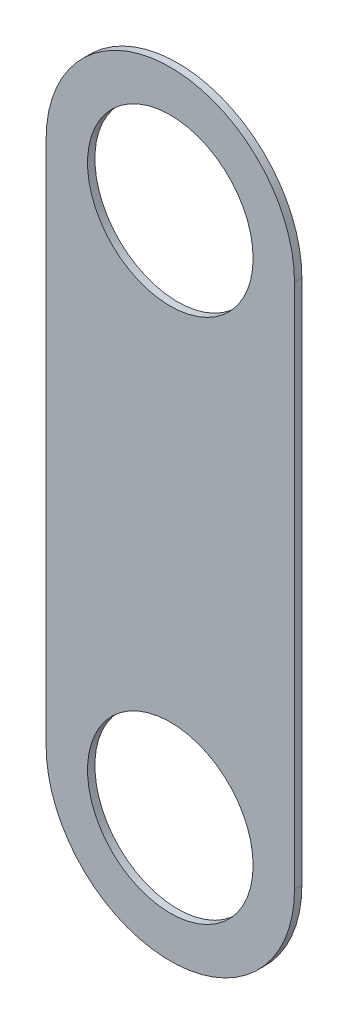
ISO-10303-21;
HEADER;
FILE_DESCRIPTION(('STEP AP214'),'2;1');
FILE_NAME('part.step','',(''),(''),'','','');
FILE_SCHEMA(('AUTOMOTIVE_DESIGN { 1 0 10303 214 1 1 1 1 }'));
ENDSEC;
DATA;
#1=APPLICATION_CONTEXT('core data for automotive mechanical design processes');
#2=APPLICATION_PROTOCOL_DEFINITION('international standard','automotive_design',2000,#1);
#3=PRODUCT_CONTEXT('',#1,'mechanical');
#4=PRODUCT('Part','Part','',(#3));
#5=PRODUCT_RELATED_PRODUCT_CATEGORY('part','',(#4));
#6=PRODUCT_DEFINITION_FORMATION('','',#4);
#7=PRODUCT_DEFINITION_CONTEXT('part definition',#1,'design');
#8=PRODUCT_DEFINITION('design','',#6,#7);
#9=PRODUCT_DEFINITION_SHAPE('','',#8);
#10=(LENGTH_UNIT() NAMED_UNIT(*) SI_UNIT(.MILLI.,.METRE.));
#11=(NAMED_UNIT(*) PLANE_ANGLE_UNIT() SI_UNIT($,.RADIAN.));
#12=(NAMED_UNIT(*) SI_UNIT($,.STERADIAN.) SOLID_ANGLE_UNIT());
#13=UNCERTAINTY_MEASURE_WITH_UNIT(LENGTH_MEASURE(1.E-05),#10,'distance_accuracy_value','');
#14=(GEOMETRIC_REPRESENTATION_CONTEXT(3) GLOBAL_UNCERTAINTY_ASSIGNED_CONTEXT((#13)) GLOBAL_UNIT_ASSIGNED_CONTEXT((#10,
#11,#12)) REPRESENTATION_CONTEXT('',''));
#15=CARTESIAN_POINT('',(0.,0.,0.));
#16=DIRECTION('',(0.,0.,1.));
#17=DIRECTION('',(1.,0.,0.));
#18=AXIS2_PLACEMENT_3D('',#15,#16,#17);
#19=CARTESIAN_POINT('',(67.3800024,82.9600068,0.));
#20=DIRECTION('',(-1.,0.,0.));
#21=DIRECTION('',(0.,1.,0.));
#22=AXIS2_PLACEMENT_3D('',#19,#20,#21);
#23=PLANE('',#22);
#24=DIRECTION('',(0.,1.,0.));
#25=VECTOR('',#24,1.);
#26=CARTESIAN_POINT('',(67.3800024,82.9600068,0.03556));
#27=LINE('',#26,#25);
#28=CARTESIAN_POINT('',(67.3800024,82.9600068,0.03556));
#29=VERTEX_POINT('',#28);
#30=CARTESIAN_POINT('',(67.3800024,85.5000068,0.03556));
#31=VERTEX_POINT('',#30);
#32=EDGE_CURVE('E11',#29,#31,#27,.T.);
#33=ORIENTED_EDGE('',*,*,#32,.F.);
#34=DIRECTION('',(0.,0.,1.));
#35=VECTOR('',#34,1.);
#36=CARTESIAN_POINT('',(67.3800024,82.9600068,0.));
#37=LINE('',#36,#35);
#38=CARTESIAN_POINT('',(67.3800024,82.9600068,0.));
#39=VERTEX_POINT('',#38);
#40=EDGE_CURVE('E24',#39,#29,#37,.T.);
#41=ORIENTED_EDGE('',*,*,#40,.F.);
#42=DIRECTION('',(0.,1.,0.));
#43=VECTOR('',#42,1.);
#44=CARTESIAN_POINT('',(67.3800024,82.9600068,0.));
#45=LINE('',#44,#43);
#46=CARTESIAN_POINT('',(67.3800024,85.5000068,0.));
#47=VERTEX_POINT('',#46);
#48=EDGE_CURVE('E110',#39,#47,#45,.T.);
#49=ORIENTED_EDGE('',*,*,#48,.T.);
#50=DIRECTION('',(0.,0.,1.));
#51=VECTOR('',#50,1.);
#52=CARTESIAN_POINT('',(67.3800024,85.5000068,0.));
#53=LINE('',#52,#51);
#54=EDGE_CURVE('E37',#47,#31,#53,.T.);
#55=ORIENTED_EDGE('',*,*,#54,.T.);
#56=EDGE_LOOP('',(#33,#41,#49,#55));
#57=FACE_BOUND('',#56,.T.);
#58=ADVANCED_FACE('F17',(#57),#23,.F.);
#59=CARTESIAN_POINT('',(66.7800036,82.9600068,0.));
#60=DIRECTION('',(0.,0.,-1.));
#61=DIRECTION('',(-1.,0.,0.));
#62=AXIS2_PLACEMENT_3D('',#59,#60,#61);
#63=CYLINDRICAL_SURFACE('',#62,0.599998800000004);
#64=CARTESIAN_POINT('',(66.7800036,82.9600068,0.03556));
#65=DIRECTION('',(0.,0.,1.));
#66=DIRECTION('',(-1.,0.,0.));
#67=AXIS2_PLACEMENT_3D('',#64,#65,#66);
#68=CIRCLE('',#67,0.599998800000004);
#69=CARTESIAN_POINT('',(66.1800048,82.9600068,0.03556));
#70=VERTEX_POINT('',#69);
#71=EDGE_CURVE('E106',#70,#29,#68,.T.);
#72=ORIENTED_EDGE('',*,*,#71,.F.);
#73=DIRECTION('',(0.,0.,1.));
#74=VECTOR('',#73,1.);
#75=CARTESIAN_POINT('',(66.1800048,82.9600068,0.));
#76=LINE('',#75,#74);
#77=CARTESIAN_POINT('',(66.1800048,82.9600068,0.));
#78=VERTEX_POINT('',#77);
#79=EDGE_CURVE('E104',#78,#70,#76,.T.);
#80=ORIENTED_EDGE('',*,*,#79,.F.);
#81=CARTESIAN_POINT('',(66.7800036,82.9600068,0.));
#82=DIRECTION('',(0.,0.,1.));
#83=DIRECTION('',(-1.,0.,0.));
#84=AXIS2_PLACEMENT_3D('',#81,#82,#83);
#85=CIRCLE('',#84,0.599998800000004);
#86=EDGE_CURVE('E102',#78,#39,#85,.T.);
#87=ORIENTED_EDGE('',*,*,#86,.T.);
#88=ORIENTED_EDGE('',*,*,#40,.T.);
#89=EDGE_LOOP('',(#72,#80,#87,#88));
#90=FACE_BOUND('',#89,.T.);
#91=ADVANCED_FACE('F126',(#90),#63,.T.);
#92=CARTESIAN_POINT('',(66.7800036,85.5000068,0.));
#93=DIRECTION('',(0.,0.,-1.));
#94=DIRECTION('',(1.,0.,0.));
#95=AXIS2_PLACEMENT_3D('',#92,#93,#94);
#96=CYLINDRICAL_SURFACE('',#95,0.599998800000004);
#97=CARTESIAN_POINT('',(66.7800036,85.5000068,0.03556));
#98=DIRECTION('',(0.,0.,1.));
#99=DIRECTION('',(1.,0.,0.));
#100=AXIS2_PLACEMENT_3D('',#97,#98,#99);
#101=CIRCLE('',#100,0.599998800000004);
#102=CARTESIAN_POINT('',(66.1800048,85.5000068,0.03556));
#103=VERTEX_POINT('',#102);
#104=EDGE_CURVE('E99',#31,#103,#101,.T.);
#105=ORIENTED_EDGE('',*,*,#104,.F.);
#106=ORIENTED_EDGE('',*,*,#54,.F.);
#107=CARTESIAN_POINT('',(66.7800036,85.5000068,0.));
#108=DIRECTION('',(0.,0.,1.));
#109=DIRECTION('',(1.,0.,0.));
#110=AXIS2_PLACEMENT_3D('',#107,#108,#109);
#111=CIRCLE('',#110,0.599998800000004);
#112=CARTESIAN_POINT('',(66.1800048,85.5000068,0.));
#113=VERTEX_POINT('',#112);
#114=EDGE_CURVE('E96',#47,#113,#111,.T.);
#115=ORIENTED_EDGE('',*,*,#114,.T.);
#116=DIRECTION('',(0.,0.,1.));
#117=VECTOR('',#116,1.);
#118=CARTESIAN_POINT('',(66.1800048,85.5000068,0.));
#119=LINE('',#118,#117);
#120=EDGE_CURVE('E94',#113,#103,#119,.T.);
#121=ORIENTED_EDGE('',*,*,#120,.T.);
#122=EDGE_LOOP('',(#105,#106,#115,#121));
#123=FACE_BOUND('',#122,.T.);
#124=ADVANCED_FACE('F119',(#123),#96,.T.);
#125=CARTESIAN_POINT('',(66.1800048,85.5000068,0.));
#126=DIRECTION('',(1.,0.,0.));
#127=DIRECTION('',(0.,-1.,0.));
#128=AXIS2_PLACEMENT_3D('',#125,#126,#127);
#129=PLANE('',#128);
#130=DIRECTION('',(0.,-1.,0.));
#131=VECTOR('',#130,1.);
#132=CARTESIAN_POINT('',(66.1800048,85.5000068,0.03556));
#133=LINE('',#132,#131);
#134=EDGE_CURVE('E91',#103,#70,#133,.T.);
#135=ORIENTED_EDGE('',*,*,#134,.F.);
#136=ORIENTED_EDGE('',*,*,#120,.F.);
#137=DIRECTION('',(0.,-1.,0.));
#138=VECTOR('',#137,1.);
#139=CARTESIAN_POINT('',(66.1800048,85.5000068,0.));
#140=LINE('',#139,#138);
#141=EDGE_CURVE('E88',#113,#78,#140,.T.);
#142=ORIENTED_EDGE('',*,*,#141,.T.);
#143=ORIENTED_EDGE('',*,*,#79,.T.);
#144=EDGE_LOOP('',(#135,#136,#142,#143));
#145=FACE_BOUND('',#144,.T.);
#146=ADVANCED_FACE('F125',(#145),#129,.F.);
#147=CARTESIAN_POINT('',(66.7800036,85.5000068,0.));
#148=DIRECTION('',(0.,0.,-1.));
#149=DIRECTION('',(1.,0.,0.));
#150=AXIS2_PLACEMENT_3D('',#147,#148,#149);
#151=CYLINDRICAL_SURFACE('',#150,0.3999992);
#152=DIRECTION('',(0.,0.,1.));
#153=VECTOR('',#152,1.);
#154=CARTESIAN_POINT('',(67.1800028,85.5000068,0.));
#155=LINE('',#154,#153);
#156=CARTESIAN_POINT('',(67.1800028,85.5000068,0.));
#157=VERTEX_POINT('',#156);
#158=CARTESIAN_POINT('',(67.1800028,85.5000068,0.03556));
#159=VERTEX_POINT('',#158);
#160=EDGE_CURVE('E86',#157,#159,#155,.T.);
#161=ORIENTED_EDGE('',*,*,#160,.T.);
#162=CARTESIAN_POINT('',(66.7800036,85.5000068,0.03556));
#163=DIRECTION('',(0.,0.,1.));
#164=DIRECTION('',(1.,0.,0.));
#165=AXIS2_PLACEMENT_3D('',#162,#163,#164);
#166=CIRCLE('',#165,0.3999992);
#167=EDGE_CURVE('E83',#159,#159,#166,.T.);
#168=ORIENTED_EDGE('',*,*,#167,.T.);
#169=ORIENTED_EDGE('',*,*,#160,.F.);
#170=CARTESIAN_POINT('',(66.7800036,85.5000068,0.));
#171=DIRECTION('',(0.,0.,1.));
#172=DIRECTION('',(1.,0.,0.));
#173=AXIS2_PLACEMENT_3D('',#170,#171,#172);
#174=CIRCLE('',#173,0.3999992);
#175=EDGE_CURVE('E74',#157,#157,#174,.T.);
#176=ORIENTED_EDGE('',*,*,#175,.F.);
#177=EDGE_LOOP('',(#161,#168,#169,#176));
#178=FACE_BOUND('',#177,.T.);
#179=ADVANCED_FACE('F137',(#178),#151,.F.);
#180=CARTESIAN_POINT('',(66.7800036,82.9600068,0.));
#181=DIRECTION('',(0.,0.,-1.));
#182=DIRECTION('',(1.,0.,0.));
#183=AXIS2_PLACEMENT_3D('',#180,#181,#182);
#184=CYLINDRICAL_SURFACE('',#183,0.3999992);
#185=DIRECTION('',(0.,0.,1.));
#186=VECTOR('',#185,1.);
#187=CARTESIAN_POINT('',(67.1800028,82.9600068,0.));
#188=LINE('',#187,#186);
#189=CARTESIAN_POINT('',(67.1800028,82.9600068,0.));
#190=VERTEX_POINT('',#189);
#191=CARTESIAN_POINT('',(67.1800028,82.9600068,0.03556));
#192=VERTEX_POINT('',#191);
#193=EDGE_CURVE('E68',#190,#192,#188,.T.);
#194=ORIENTED_EDGE('',*,*,#193,.T.);
#195=CARTESIAN_POINT('',(66.7800036,82.9600068,0.03556));
#196=DIRECTION('',(0.,0.,1.));
#197=DIRECTION('',(1.,0.,0.));
#198=AXIS2_PLACEMENT_3D('',#195,#196,#197);
#199=CIRCLE('',#198,0.3999992);
#200=EDGE_CURVE('E73',#192,#192,#199,.T.);
#201=ORIENTED_EDGE('',*,*,#200,.T.);
#202=ORIENTED_EDGE('',*,*,#193,.F.);
#203=CARTESIAN_POINT('',(66.7800036,82.9600068,0.));
#204=DIRECTION('',(0.,0.,1.));
#205=DIRECTION('',(1.,0.,0.));
#206=AXIS2_PLACEMENT_3D('',#203,#204,#205);
#207=CIRCLE('',#206,0.3999992);
#208=EDGE_CURVE('E71',#190,#190,#207,.T.);
#209=ORIENTED_EDGE('',*,*,#208,.F.);
#210=EDGE_LOOP('',(#194,#201,#202,#209));
#211=FACE_BOUND('',#210,.T.);
#212=ADVANCED_FACE('F70',(#211),#184,.F.);
#213=CARTESIAN_POINT('',(67.3800024,82.9600068,0.));
#214=DIRECTION('',(0.,0.,-1.));
#215=DIRECTION('',(-1.,0.,0.));
#216=AXIS2_PLACEMENT_3D('',#213,#214,#215);
#217=PLANE('',#216);
#218=ORIENTED_EDGE('',*,*,#48,.F.);
#219=ORIENTED_EDGE('',*,*,#86,.F.);
#220=ORIENTED_EDGE('',*,*,#141,.F.);
#221=ORIENTED_EDGE('',*,*,#114,.F.);
#222=EDGE_LOOP('',(#218,#219,#220,#221));
#223=FACE_BOUND('',#222,.T.);
#224=ORIENTED_EDGE('',*,*,#175,.T.);
#225=EDGE_LOOP('',(#224));
#226=FACE_BOUND('',#225,.T.);
#227=ORIENTED_EDGE('',*,*,#208,.T.);
#228=EDGE_LOOP('',(#227));
#229=FACE_BOUND('',#228,.T.);
#230=ADVANCED_FACE('F77',(#223,#226,#229),#217,.T.);
#231=CARTESIAN_POINT('',(67.3800024,82.9600068,0.03556));
#232=DIRECTION('',(0.,0.,-1.));
#233=DIRECTION('',(-1.,0.,0.));
#234=AXIS2_PLACEMENT_3D('',#231,#232,#233);
#235=PLANE('',#234);
#236=ORIENTED_EDGE('',*,*,#134,.T.);
#237=ORIENTED_EDGE('',*,*,#71,.T.);
#238=ORIENTED_EDGE('',*,*,#32,.T.);
#239=ORIENTED_EDGE('',*,*,#104,.T.);
#240=EDGE_LOOP('',(#236,#237,#238,#239));
#241=FACE_BOUND('',#240,.T.);
#242=ORIENTED_EDGE('',*,*,#167,.F.);
#243=EDGE_LOOP('',(#242));
#244=FACE_BOUND('',#243,.T.);
#245=ORIENTED_EDGE('',*,*,#200,.F.);
#246=EDGE_LOOP('',(#245));
#247=FACE_BOUND('',#246,.T.);
#248=ADVANCED_FACE('F122',(#241,#244,#247),#235,.F.);
#249=CLOSED_SHELL('',(#58,#91,#124,#146,#179,#212,#230,#248));
#250=MANIFOLD_SOLID_BREP('B1',#249);
#251=ADVANCED_BREP_SHAPE_REPRESENTATION('',(#18,#250),#14);
#252=SHAPE_DEFINITION_REPRESENTATION(#9,#251);
ENDSEC;
END-ISO-10303-21;
